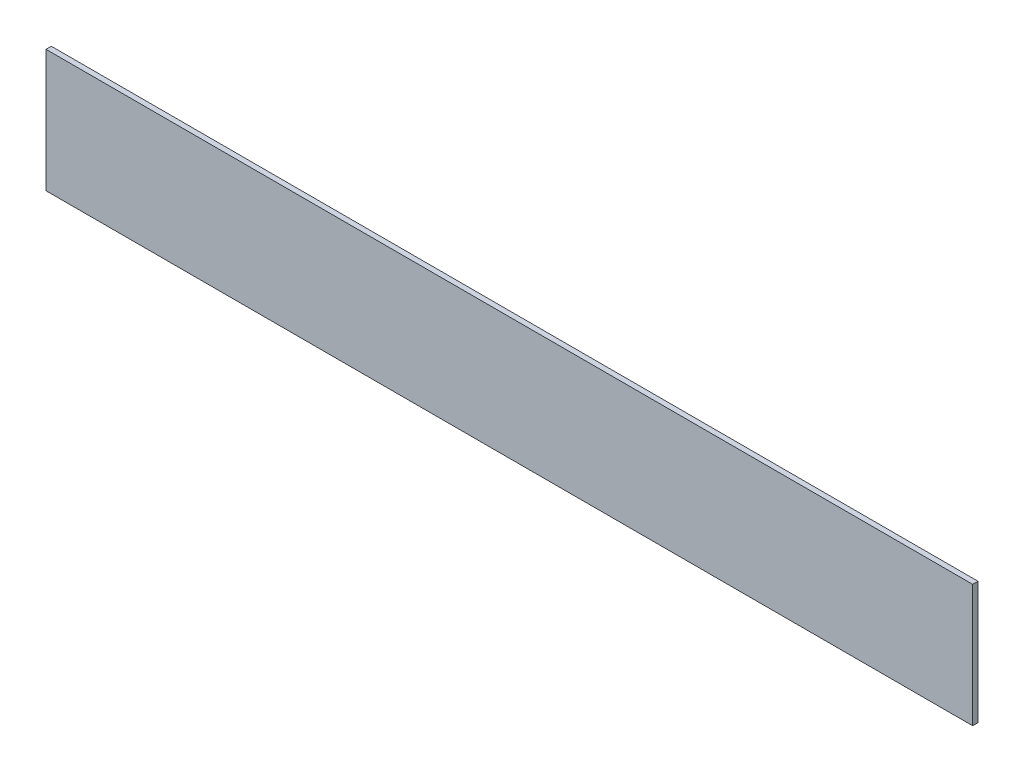
ISO-10303-21;
HEADER;
FILE_DESCRIPTION(('STEP AP214'),'2;1');
FILE_NAME('part.step','',(''),(''),'','','');
FILE_SCHEMA(('AUTOMOTIVE_DESIGN { 1 0 10303 214 1 1 1 1 }'));
ENDSEC;
DATA;
#1=APPLICATION_CONTEXT('core data for automotive mechanical design processes');
#2=APPLICATION_PROTOCOL_DEFINITION('international standard','automotive_design',2000,#1);
#3=PRODUCT_CONTEXT('',#1,'mechanical');
#4=PRODUCT('Part','Part','',(#3));
#5=PRODUCT_RELATED_PRODUCT_CATEGORY('part','',(#4));
#6=PRODUCT_DEFINITION_FORMATION('','',#4);
#7=PRODUCT_DEFINITION_CONTEXT('part definition',#1,'design');
#8=PRODUCT_DEFINITION('design','',#6,#7);
#9=PRODUCT_DEFINITION_SHAPE('','',#8);
#10=(LENGTH_UNIT() NAMED_UNIT(*) SI_UNIT(.MILLI.,.METRE.));
#11=(NAMED_UNIT(*) PLANE_ANGLE_UNIT() SI_UNIT($,.RADIAN.));
#12=(NAMED_UNIT(*) SI_UNIT($,.STERADIAN.) SOLID_ANGLE_UNIT());
#13=UNCERTAINTY_MEASURE_WITH_UNIT(LENGTH_MEASURE(1.E-05),#10,'distance_accuracy_value','');
#14=(GEOMETRIC_REPRESENTATION_CONTEXT(3) GLOBAL_UNCERTAINTY_ASSIGNED_CONTEXT((#13)) GLOBAL_UNIT_ASSIGNED_CONTEXT((#10,
#11,#12)) REPRESENTATION_CONTEXT('',''));
#15=CARTESIAN_POINT('',(0.,0.,0.));
#16=DIRECTION('',(0.,0.,1.));
#17=DIRECTION('',(1.,0.,0.));
#18=AXIS2_PLACEMENT_3D('',#15,#16,#17);
#19=CARTESIAN_POINT('',(276.225,36.5125,3.175));
#20=DIRECTION('',(-1.,0.,0.));
#21=DIRECTION('',(0.,-1.,0.));
#22=AXIS2_PLACEMENT_3D('',#19,#20,#21);
#23=PLANE('',#22);
#24=DIRECTION('',(0.,1.,0.));
#25=VECTOR('',#24,1.);
#26=CARTESIAN_POINT('',(276.225,36.5125,0.));
#27=LINE('',#26,#25);
#28=CARTESIAN_POINT('',(276.225,-36.5125,0.));
#29=VERTEX_POINT('',#28);
#30=CARTESIAN_POINT('',(276.225,36.5125,0.));
#31=VERTEX_POINT('',#30);
#32=EDGE_CURVE('E113',#29,#31,#27,.T.);
#33=ORIENTED_EDGE('',*,*,#32,.T.);
#34=DIRECTION('',(0.,0.,-1.));
#35=VECTOR('',#34,1.);
#36=CARTESIAN_POINT('',(276.225,36.5125,3.175));
#37=LINE('',#36,#35);
#38=CARTESIAN_POINT('',(276.225,36.5125,3.175));
#39=VERTEX_POINT('',#38);
#40=EDGE_CURVE('E11',#39,#31,#37,.T.);
#41=ORIENTED_EDGE('',*,*,#40,.F.);
#42=DIRECTION('',(0.,1.,0.));
#43=VECTOR('',#42,1.);
#44=CARTESIAN_POINT('',(276.225,36.5125,3.175));
#45=LINE('',#44,#43);
#46=CARTESIAN_POINT('',(276.225,-36.5125,3.175));
#47=VERTEX_POINT('',#46);
#48=EDGE_CURVE('E97',#47,#39,#45,.T.);
#49=ORIENTED_EDGE('',*,*,#48,.F.);
#50=DIRECTION('',(0.,0.,-1.));
#51=VECTOR('',#50,1.);
#52=CARTESIAN_POINT('',(276.225,-36.5125,3.175));
#53=LINE('',#52,#51);
#54=EDGE_CURVE('E109',#47,#29,#53,.T.);
#55=ORIENTED_EDGE('',*,*,#54,.T.);
#56=EDGE_LOOP('',(#33,#41,#49,#55));
#57=FACE_BOUND('',#56,.T.);
#58=ADVANCED_FACE('F45',(#57),#23,.F.);
#59=CARTESIAN_POINT('',(-276.225,36.5125,3.175));
#60=DIRECTION('',(0.,-1.,0.));
#61=DIRECTION('',(0.,0.,-1.));
#62=AXIS2_PLACEMENT_3D('',#59,#60,#61);
#63=PLANE('',#62);
#64=DIRECTION('',(-1.,0.,0.));
#65=VECTOR('',#64,1.);
#66=CARTESIAN_POINT('',(-276.225,36.5125,0.));
#67=LINE('',#66,#65);
#68=CARTESIAN_POINT('',(-276.225,36.5125,0.));
#69=VERTEX_POINT('',#68);
#70=EDGE_CURVE('E102',#31,#69,#67,.T.);
#71=ORIENTED_EDGE('',*,*,#70,.T.);
#72=DIRECTION('',(0.,0.,-1.));
#73=VECTOR('',#72,1.);
#74=CARTESIAN_POINT('',(-276.225,36.5125,3.175));
#75=LINE('',#74,#73);
#76=CARTESIAN_POINT('',(-276.225,36.5125,3.175));
#77=VERTEX_POINT('',#76);
#78=EDGE_CURVE('E54',#77,#69,#75,.T.);
#79=ORIENTED_EDGE('',*,*,#78,.F.);
#80=DIRECTION('',(-1.,0.,0.));
#81=VECTOR('',#80,1.);
#82=CARTESIAN_POINT('',(-276.225,36.5125,3.175));
#83=LINE('',#82,#81);
#84=EDGE_CURVE('E92',#39,#77,#83,.T.);
#85=ORIENTED_EDGE('',*,*,#84,.F.);
#86=ORIENTED_EDGE('',*,*,#40,.T.);
#87=EDGE_LOOP('',(#71,#79,#85,#86));
#88=FACE_BOUND('',#87,.T.);
#89=ADVANCED_FACE('F101',(#88),#63,.F.);
#90=CARTESIAN_POINT('',(-276.225,36.5125,3.175));
#91=DIRECTION('',(1.,0.,0.));
#92=DIRECTION('',(0.,0.,-1.));
#93=AXIS2_PLACEMENT_3D('',#90,#91,#92);
#94=PLANE('',#93);
#95=DIRECTION('',(0.,-1.,0.));
#96=VECTOR('',#95,1.);
#97=CARTESIAN_POINT('',(-276.225,36.5125,0.));
#98=LINE('',#97,#96);
#99=CARTESIAN_POINT('',(-276.225,-36.5125,0.));
#100=VERTEX_POINT('',#99);
#101=EDGE_CURVE('E79',#69,#100,#98,.T.);
#102=ORIENTED_EDGE('',*,*,#101,.T.);
#103=DIRECTION('',(0.,0.,-1.));
#104=VECTOR('',#103,1.);
#105=CARTESIAN_POINT('',(-276.225,-36.5125,3.175));
#106=LINE('',#105,#104);
#107=CARTESIAN_POINT('',(-276.225,-36.5125,3.175));
#108=VERTEX_POINT('',#107);
#109=EDGE_CURVE('E104',#108,#100,#106,.T.);
#110=ORIENTED_EDGE('',*,*,#109,.F.);
#111=DIRECTION('',(0.,-1.,0.));
#112=VECTOR('',#111,1.);
#113=CARTESIAN_POINT('',(-276.225,36.5125,3.175));
#114=LINE('',#113,#112);
#115=EDGE_CURVE('E95',#77,#108,#114,.T.);
#116=ORIENTED_EDGE('',*,*,#115,.F.);
#117=ORIENTED_EDGE('',*,*,#78,.T.);
#118=EDGE_LOOP('',(#102,#110,#116,#117));
#119=FACE_BOUND('',#118,.T.);
#120=ADVANCED_FACE('F105',(#119),#94,.F.);
#121=CARTESIAN_POINT('',(-276.225,-36.5125,3.175));
#122=DIRECTION('',(0.,1.,0.));
#123=DIRECTION('',(0.,0.,1.));
#124=AXIS2_PLACEMENT_3D('',#121,#122,#123);
#125=PLANE('',#124);
#126=DIRECTION('',(1.,0.,0.));
#127=VECTOR('',#126,1.);
#128=CARTESIAN_POINT('',(-276.225,-36.5125,0.));
#129=LINE('',#128,#127);
#130=EDGE_CURVE('E85',#100,#29,#129,.T.);
#131=ORIENTED_EDGE('',*,*,#130,.T.);
#132=ORIENTED_EDGE('',*,*,#54,.F.);
#133=DIRECTION('',(1.,0.,0.));
#134=VECTOR('',#133,1.);
#135=CARTESIAN_POINT('',(-276.225,-36.5125,3.175));
#136=LINE('',#135,#134);
#137=EDGE_CURVE('E62',#108,#47,#136,.T.);
#138=ORIENTED_EDGE('',*,*,#137,.F.);
#139=ORIENTED_EDGE('',*,*,#109,.T.);
#140=EDGE_LOOP('',(#131,#132,#138,#139));
#141=FACE_BOUND('',#140,.T.);
#142=ADVANCED_FACE('F126',(#141),#125,.F.);
#143=CARTESIAN_POINT('',(0.,0.,3.175));
#144=DIRECTION('',(0.,0.,1.));
#145=DIRECTION('',(1.,0.,0.));
#146=AXIS2_PLACEMENT_3D('',#143,#144,#145);
#147=PLANE('',#146);
#148=ORIENTED_EDGE('',*,*,#48,.T.);
#149=ORIENTED_EDGE('',*,*,#84,.T.);
#150=ORIENTED_EDGE('',*,*,#115,.T.);
#151=ORIENTED_EDGE('',*,*,#137,.T.);
#152=EDGE_LOOP('',(#148,#149,#150,#151));
#153=FACE_BOUND('',#152,.T.);
#154=ADVANCED_FACE('F93',(#153),#147,.T.);
#155=CARTESIAN_POINT('',(0.,0.,0.));
#156=DIRECTION('',(0.,0.,1.));
#157=DIRECTION('',(1.,0.,0.));
#158=AXIS2_PLACEMENT_3D('',#155,#156,#157);
#159=PLANE('',#158);
#160=ORIENTED_EDGE('',*,*,#32,.F.);
#161=ORIENTED_EDGE('',*,*,#130,.F.);
#162=ORIENTED_EDGE('',*,*,#101,.F.);
#163=ORIENTED_EDGE('',*,*,#70,.F.);
#164=EDGE_LOOP('',(#160,#161,#162,#163));
#165=FACE_BOUND('',#164,.T.);
#166=ADVANCED_FACE('F129',(#165),#159,.F.);
#167=CLOSED_SHELL('',(#58,#89,#120,#142,#154,#166));
#168=MANIFOLD_SOLID_BREP('B2',#167);
#169=ADVANCED_BREP_SHAPE_REPRESENTATION('',(#18,#168),#14);
#170=SHAPE_DEFINITION_REPRESENTATION(#9,#169);
ENDSEC;
END-ISO-10303-21;
